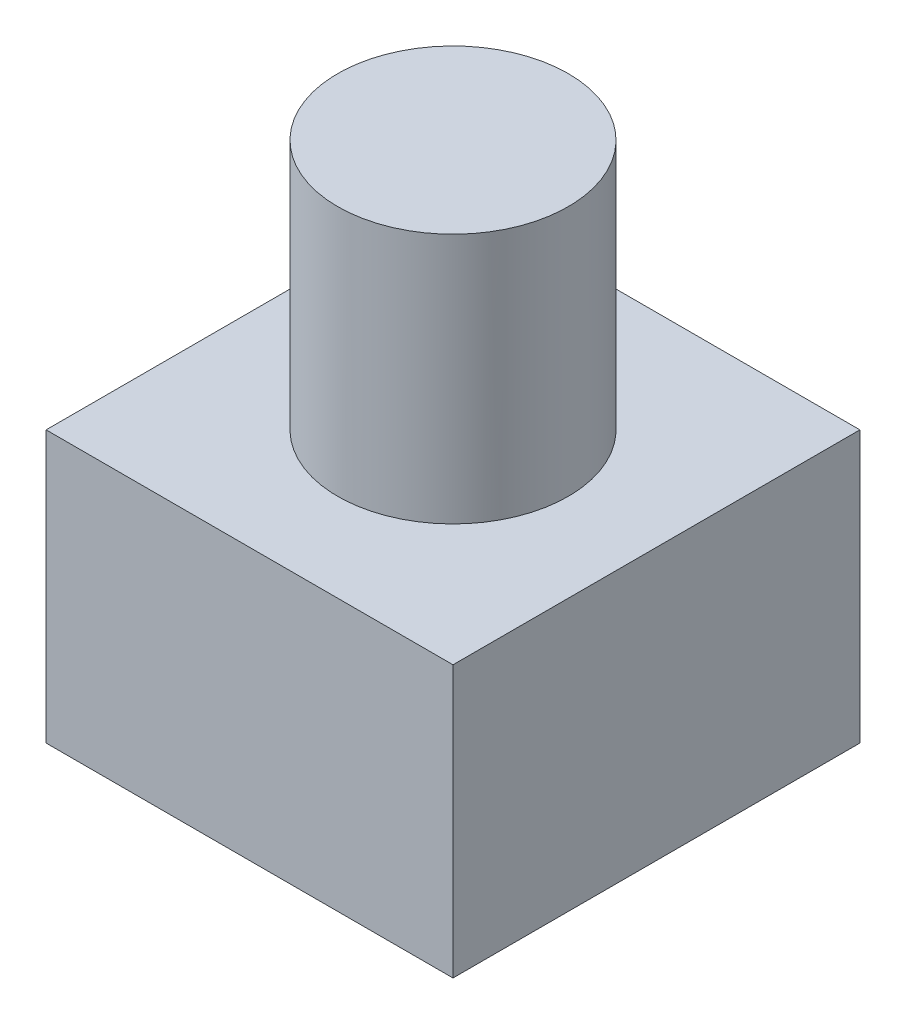
ISO-10303-21;
HEADER;
FILE_DESCRIPTION(('STEP AP214'),'2;1');
FILE_NAME('part.step','',(''),(''),'','','');
FILE_SCHEMA(('AUTOMOTIVE_DESIGN { 1 0 10303 214 1 1 1 1 }'));
ENDSEC;
DATA;
#1=APPLICATION_CONTEXT('core data for automotive mechanical design processes');
#2=APPLICATION_PROTOCOL_DEFINITION('international standard','automotive_design',2000,#1);
#3=PRODUCT_CONTEXT('',#1,'mechanical');
#4=PRODUCT('Part','Part','',(#3));
#5=PRODUCT_RELATED_PRODUCT_CATEGORY('part','',(#4));
#6=PRODUCT_DEFINITION_FORMATION('','',#4);
#7=PRODUCT_DEFINITION_CONTEXT('part definition',#1,'design');
#8=PRODUCT_DEFINITION('design','',#6,#7);
#9=PRODUCT_DEFINITION_SHAPE('','',#8);
#10=(LENGTH_UNIT() NAMED_UNIT(*) SI_UNIT(.MILLI.,.METRE.));
#11=(NAMED_UNIT(*) PLANE_ANGLE_UNIT() SI_UNIT($,.RADIAN.));
#12=(NAMED_UNIT(*) SI_UNIT($,.STERADIAN.) SOLID_ANGLE_UNIT());
#13=UNCERTAINTY_MEASURE_WITH_UNIT(LENGTH_MEASURE(1.E-05),#10,'distance_accuracy_value','');
#14=(GEOMETRIC_REPRESENTATION_CONTEXT(3) GLOBAL_UNCERTAINTY_ASSIGNED_CONTEXT((#13)) GLOBAL_UNIT_ASSIGNED_CONTEXT((#10,
#11,#12)) REPRESENTATION_CONTEXT('',''));
#15=CARTESIAN_POINT('',(0.,0.,0.));
#16=DIRECTION('',(0.,0.,1.));
#17=DIRECTION('',(1.,0.,0.));
#18=AXIS2_PLACEMENT_3D('',#15,#16,#17);
#19=CARTESIAN_POINT('',(0.,4.,-6.));
#20=DIRECTION('',(0.,-1.,0.));
#21=DIRECTION('',(0.,0.,-1.));
#22=AXIS2_PLACEMENT_3D('',#19,#20,#21);
#23=PLANE('',#22);
#24=DIRECTION('',(0.,0.,1.));
#25=VECTOR('',#24,1.);
#26=CARTESIAN_POINT('',(0.,4.,0.));
#27=LINE('',#26,#25);
#28=CARTESIAN_POINT('',(0.,4.,-6.));
#29=VERTEX_POINT('',#28);
#30=CARTESIAN_POINT('',(0.,4.,0.));
#31=VERTEX_POINT('',#30);
#32=EDGE_CURVE('E88',#29,#31,#27,.T.);
#33=ORIENTED_EDGE('',*,*,#32,.T.);
#34=DIRECTION('',(1.,0.,0.));
#35=VECTOR('',#34,1.);
#36=CARTESIAN_POINT('',(0.,4.,0.));
#37=LINE('',#36,#35);
#38=CARTESIAN_POINT('',(6.,4.,0.));
#39=VERTEX_POINT('',#38);
#40=EDGE_CURVE('E83',#31,#39,#37,.T.);
#41=ORIENTED_EDGE('',*,*,#40,.T.);
#42=DIRECTION('',(0.,0.,-1.));
#43=VECTOR('',#42,1.);
#44=CARTESIAN_POINT('',(6.,4.,0.));
#45=LINE('',#44,#43);
#46=CARTESIAN_POINT('',(6.,4.,-6.));
#47=VERTEX_POINT('',#46);
#48=EDGE_CURVE('E86',#39,#47,#45,.T.);
#49=ORIENTED_EDGE('',*,*,#48,.T.);
#50=DIRECTION('',(-1.,0.,0.));
#51=VECTOR('',#50,1.);
#52=CARTESIAN_POINT('',(0.,4.,-6.));
#53=LINE('',#52,#51);
#54=EDGE_CURVE('E52',#47,#29,#53,.T.);
#55=ORIENTED_EDGE('',*,*,#54,.T.);
#56=EDGE_LOOP('',(#33,#41,#49,#55));
#57=FACE_BOUND('',#56,.T.);
#58=CARTESIAN_POINT('',(3.,4.,-3.));
#59=DIRECTION('',(0.,-1.,0.));
#60=DIRECTION('',(0.,0.,-1.));
#61=AXIS2_PLACEMENT_3D('',#58,#59,#60);
#62=CIRCLE('',#61,1.7);
#63=CARTESIAN_POINT('',(3.,4.,-4.7));
#64=VERTEX_POINT('',#63);
#65=EDGE_CURVE('E11',#64,#64,#62,.F.);
#66=ORIENTED_EDGE('',*,*,#65,.F.);
#67=EDGE_LOOP('',(#66));
#68=FACE_BOUND('',#67,.T.);
#69=ADVANCED_FACE('F35',(#57,#68),#23,.F.);
#70=CARTESIAN_POINT('',(0.,4.,0.));
#71=DIRECTION('',(1.,0.,0.));
#72=DIRECTION('',(0.,0.,-1.));
#73=AXIS2_PLACEMENT_3D('',#70,#71,#72);
#74=PLANE('',#73);
#75=DIRECTION('',(0.,0.,1.));
#76=VECTOR('',#75,1.);
#77=CARTESIAN_POINT('',(0.,0.,0.));
#78=LINE('',#77,#76);
#79=CARTESIAN_POINT('',(0.,0.,-6.));
#80=VERTEX_POINT('',#79);
#81=CARTESIAN_POINT('',(0.,0.,0.));
#82=VERTEX_POINT('',#81);
#83=EDGE_CURVE('E102',#80,#82,#78,.T.);
#84=ORIENTED_EDGE('',*,*,#83,.T.);
#85=DIRECTION('',(0.,-1.,0.));
#86=VECTOR('',#85,1.);
#87=CARTESIAN_POINT('',(0.,4.,0.));
#88=LINE('',#87,#86);
#89=EDGE_CURVE('E44',#31,#82,#88,.T.);
#90=ORIENTED_EDGE('',*,*,#89,.F.);
#91=ORIENTED_EDGE('',*,*,#32,.F.);
#92=DIRECTION('',(0.,-1.,0.));
#93=VECTOR('',#92,1.);
#94=CARTESIAN_POINT('',(0.,4.,-6.));
#95=LINE('',#94,#93);
#96=EDGE_CURVE('E98',#29,#80,#95,.T.);
#97=ORIENTED_EDGE('',*,*,#96,.T.);
#98=EDGE_LOOP('',(#84,#90,#91,#97));
#99=FACE_BOUND('',#98,.T.);
#100=ADVANCED_FACE('F37',(#99),#74,.F.);
#101=CARTESIAN_POINT('',(0.,4.,0.));
#102=DIRECTION('',(0.,0.,-1.));
#103=DIRECTION('',(-1.,0.,0.));
#104=AXIS2_PLACEMENT_3D('',#101,#102,#103);
#105=PLANE('',#104);
#106=DIRECTION('',(1.,0.,0.));
#107=VECTOR('',#106,1.);
#108=CARTESIAN_POINT('',(0.,0.,0.));
#109=LINE('',#108,#107);
#110=CARTESIAN_POINT('',(6.,0.,0.));
#111=VERTEX_POINT('',#110);
#112=EDGE_CURVE('E93',#82,#111,#109,.T.);
#113=ORIENTED_EDGE('',*,*,#112,.T.);
#114=DIRECTION('',(0.,-1.,0.));
#115=VECTOR('',#114,1.);
#116=CARTESIAN_POINT('',(6.,4.,0.));
#117=LINE('',#116,#115);
#118=EDGE_CURVE('E91',#39,#111,#117,.T.);
#119=ORIENTED_EDGE('',*,*,#118,.F.);
#120=ORIENTED_EDGE('',*,*,#40,.F.);
#121=ORIENTED_EDGE('',*,*,#89,.T.);
#122=EDGE_LOOP('',(#113,#119,#120,#121));
#123=FACE_BOUND('',#122,.T.);
#124=ADVANCED_FACE('F92',(#123),#105,.F.);
#125=CARTESIAN_POINT('',(6.,4.,0.));
#126=DIRECTION('',(-1.,0.,0.));
#127=DIRECTION('',(0.,0.,1.));
#128=AXIS2_PLACEMENT_3D('',#125,#126,#127);
#129=PLANE('',#128);
#130=DIRECTION('',(0.,0.,-1.));
#131=VECTOR('',#130,1.);
#132=CARTESIAN_POINT('',(6.,0.,0.));
#133=LINE('',#132,#131);
#134=CARTESIAN_POINT('',(6.,0.,-6.));
#135=VERTEX_POINT('',#134);
#136=EDGE_CURVE('E69',#111,#135,#133,.T.);
#137=ORIENTED_EDGE('',*,*,#136,.T.);
#138=DIRECTION('',(0.,-1.,0.));
#139=VECTOR('',#138,1.);
#140=CARTESIAN_POINT('',(6.,4.,-6.));
#141=LINE('',#140,#139);
#142=EDGE_CURVE('E94',#47,#135,#141,.T.);
#143=ORIENTED_EDGE('',*,*,#142,.F.);
#144=ORIENTED_EDGE('',*,*,#48,.F.);
#145=ORIENTED_EDGE('',*,*,#118,.T.);
#146=EDGE_LOOP('',(#137,#143,#144,#145));
#147=FACE_BOUND('',#146,.T.);
#148=ADVANCED_FACE('F96',(#147),#129,.F.);
#149=CARTESIAN_POINT('',(0.,4.,-6.));
#150=DIRECTION('',(0.,0.,1.));
#151=DIRECTION('',(1.,0.,0.));
#152=AXIS2_PLACEMENT_3D('',#149,#150,#151);
#153=PLANE('',#152);
#154=DIRECTION('',(-1.,0.,0.));
#155=VECTOR('',#154,1.);
#156=CARTESIAN_POINT('',(0.,0.,-6.));
#157=LINE('',#156,#155);
#158=EDGE_CURVE('E75',#135,#80,#157,.T.);
#159=ORIENTED_EDGE('',*,*,#158,.T.);
#160=ORIENTED_EDGE('',*,*,#96,.F.);
#161=ORIENTED_EDGE('',*,*,#54,.F.);
#162=ORIENTED_EDGE('',*,*,#142,.T.);
#163=EDGE_LOOP('',(#159,#160,#161,#162));
#164=FACE_BOUND('',#163,.T.);
#165=ADVANCED_FACE('F116',(#164),#153,.F.);
#166=CARTESIAN_POINT('',(0.,0.,-6.));
#167=DIRECTION('',(0.,-1.,0.));
#168=DIRECTION('',(0.,0.,-1.));
#169=AXIS2_PLACEMENT_3D('',#166,#167,#168);
#170=PLANE('',#169);
#171=ORIENTED_EDGE('',*,*,#83,.F.);
#172=ORIENTED_EDGE('',*,*,#158,.F.);
#173=ORIENTED_EDGE('',*,*,#136,.F.);
#174=ORIENTED_EDGE('',*,*,#112,.F.);
#175=EDGE_LOOP('',(#171,#172,#173,#174));
#176=FACE_BOUND('',#175,.T.);
#177=ADVANCED_FACE('F113',(#176),#170,.T.);
#178=CARTESIAN_POINT('',(3.,7.7,-3.));
#179=DIRECTION('',(0.,-1.,0.));
#180=DIRECTION('',(0.,0.,-1.));
#181=AXIS2_PLACEMENT_3D('',#178,#179,#180);
#182=CYLINDRICAL_SURFACE('',#181,1.7);
#183=CARTESIAN_POINT('',(3.,7.7,-3.));
#184=DIRECTION('',(0.,1.,0.));
#185=DIRECTION('',(0.,0.,1.));
#186=AXIS2_PLACEMENT_3D('',#183,#184,#185);
#187=CIRCLE('',#186,1.7);
#188=CARTESIAN_POINT('',(3.,7.7,-1.3));
#189=VERTEX_POINT('',#188);
#190=EDGE_CURVE('E105',#189,#189,#187,.T.);
#191=ORIENTED_EDGE('',*,*,#190,.F.);
#192=EDGE_LOOP('',(#191));
#193=FACE_BOUND('',#192,.T.);
#194=ORIENTED_EDGE('',*,*,#65,.T.);
#195=EDGE_LOOP('',(#194));
#196=FACE_BOUND('',#195,.T.);
#197=ADVANCED_FACE('F115',(#193,#196),#182,.T.);
#198=CARTESIAN_POINT('',(3.,7.7,-3.));
#199=DIRECTION('',(0.,1.,0.));
#200=DIRECTION('',(0.,0.,1.));
#201=AXIS2_PLACEMENT_3D('',#198,#199,#200);
#202=PLANE('',#201);
#203=ORIENTED_EDGE('',*,*,#190,.T.);
#204=EDGE_LOOP('',(#203));
#205=FACE_BOUND('',#204,.T.);
#206=ADVANCED_FACE('F122',(#205),#202,.T.);
#207=CLOSED_SHELL('',(#69,#100,#124,#148,#165,#177,#197,#206));
#208=MANIFOLD_SOLID_BREP('B2',#207);
#209=ADVANCED_BREP_SHAPE_REPRESENTATION('',(#18,#208),#14);
#210=SHAPE_DEFINITION_REPRESENTATION(#9,#209);
ENDSEC;
END-ISO-10303-21;
